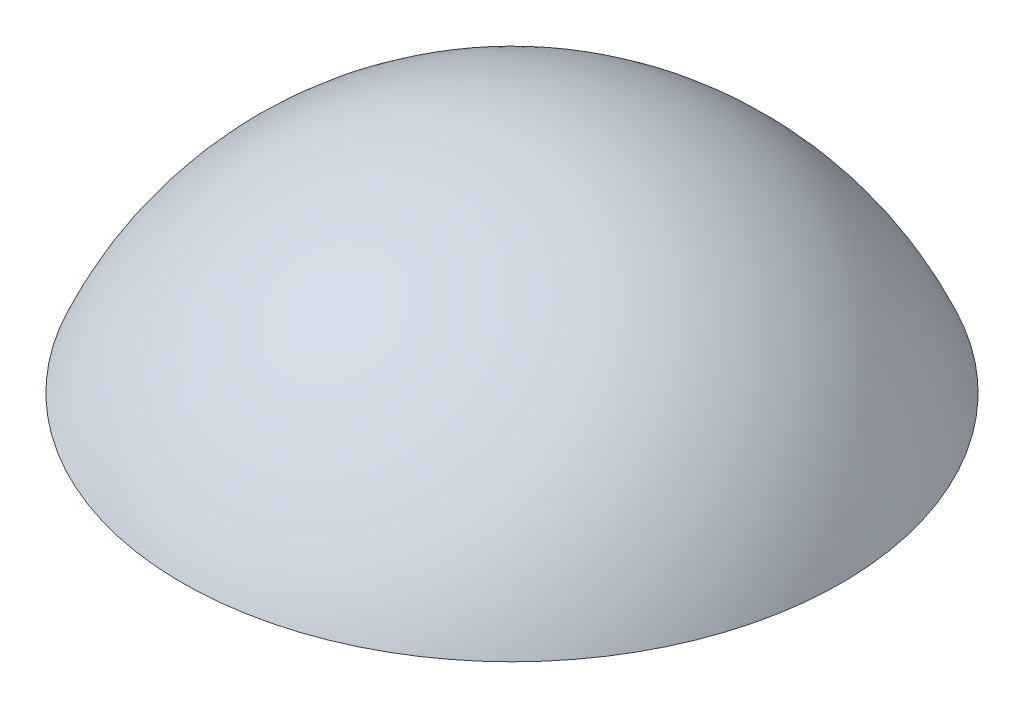
ISO-10303-21;
HEADER;
FILE_DESCRIPTION(('STEP AP214'),'2;1');
FILE_NAME('part.step','',(''),(''),'','','');
FILE_SCHEMA(('AUTOMOTIVE_DESIGN { 1 0 10303 214 1 1 1 1 }'));
ENDSEC;
DATA;
#1=APPLICATION_CONTEXT('core data for automotive mechanical design processes');
#2=APPLICATION_PROTOCOL_DEFINITION('international standard','automotive_design',2000,#1);
#3=PRODUCT_CONTEXT('',#1,'mechanical');
#4=PRODUCT('Part','Part','',(#3));
#5=PRODUCT_RELATED_PRODUCT_CATEGORY('part','',(#4));
#6=PRODUCT_DEFINITION_FORMATION('','',#4);
#7=PRODUCT_DEFINITION_CONTEXT('part definition',#1,'design');
#8=PRODUCT_DEFINITION('design','',#6,#7);
#9=PRODUCT_DEFINITION_SHAPE('','',#8);
#10=(LENGTH_UNIT() NAMED_UNIT(*) SI_UNIT(.MILLI.,.METRE.));
#11=(NAMED_UNIT(*) PLANE_ANGLE_UNIT() SI_UNIT($,.RADIAN.));
#12=(NAMED_UNIT(*) SI_UNIT($,.STERADIAN.) SOLID_ANGLE_UNIT());
#13=UNCERTAINTY_MEASURE_WITH_UNIT(LENGTH_MEASURE(1.E-05),#10,'distance_accuracy_value','');
#14=(GEOMETRIC_REPRESENTATION_CONTEXT(3) GLOBAL_UNCERTAINTY_ASSIGNED_CONTEXT((#13)) GLOBAL_UNIT_ASSIGNED_CONTEXT((#10,
#11,#12)) REPRESENTATION_CONTEXT('',''));
#15=CARTESIAN_POINT('',(0.,0.,0.));
#16=DIRECTION('',(0.,0.,1.));
#17=DIRECTION('',(1.,0.,0.));
#18=AXIS2_PLACEMENT_3D('',#15,#16,#17);
#19=CARTESIAN_POINT('',(0.,0.,0.));
#20=DIRECTION('',(0.,-1.,0.));
#21=DIRECTION('',(-1.,0.,0.));
#22=AXIS2_PLACEMENT_3D('',#19,#20,#21);
#23=SPHERICAL_SURFACE('',#22,3.2490465643865);
#24=CARTESIAN_POINT('',(0.,1.24751896881439,0.));
#25=DIRECTION('',(0.,-1.,0.));
#26=DIRECTION('',(0.,0.,-1.));
#27=AXIS2_PLACEMENT_3D('',#24,#25,#26);
#28=CIRCLE('',#27,3.);
#29=CARTESIAN_POINT('',(0.,1.24751896881439,-3.));
#30=VERTEX_POINT('',#29);
#31=EDGE_CURVE('E10',#30,#30,#28,.T.);
#32=ORIENTED_EDGE('',*,*,#31,.F.);
#33=EDGE_LOOP('',(#32));
#34=FACE_BOUND('',#33,.T.);
#35=ADVANCED_FACE('F37',(#34),#23,.T.);
#36=CARTESIAN_POINT('',(-3.,1.24751896881439,0.));
#37=DIRECTION('',(0.,1.,0.));
#38=DIRECTION('',(0.,0.,1.));
#39=AXIS2_PLACEMENT_3D('',#36,#37,#38);
#40=PLANE('',#39);
#41=ORIENTED_EDGE('',*,*,#31,.T.);
#42=EDGE_LOOP('',(#41));
#43=FACE_BOUND('',#42,.T.);
#44=ADVANCED_FACE('F45',(#43),#40,.F.);
#45=CLOSED_SHELL('',(#35,#44));
#46=MANIFOLD_SOLID_BREP('B2',#45);
#47=ADVANCED_BREP_SHAPE_REPRESENTATION('',(#18,#46),#14);
#48=SHAPE_DEFINITION_REPRESENTATION(#9,#47);
ENDSEC;
END-ISO-10303-21;
